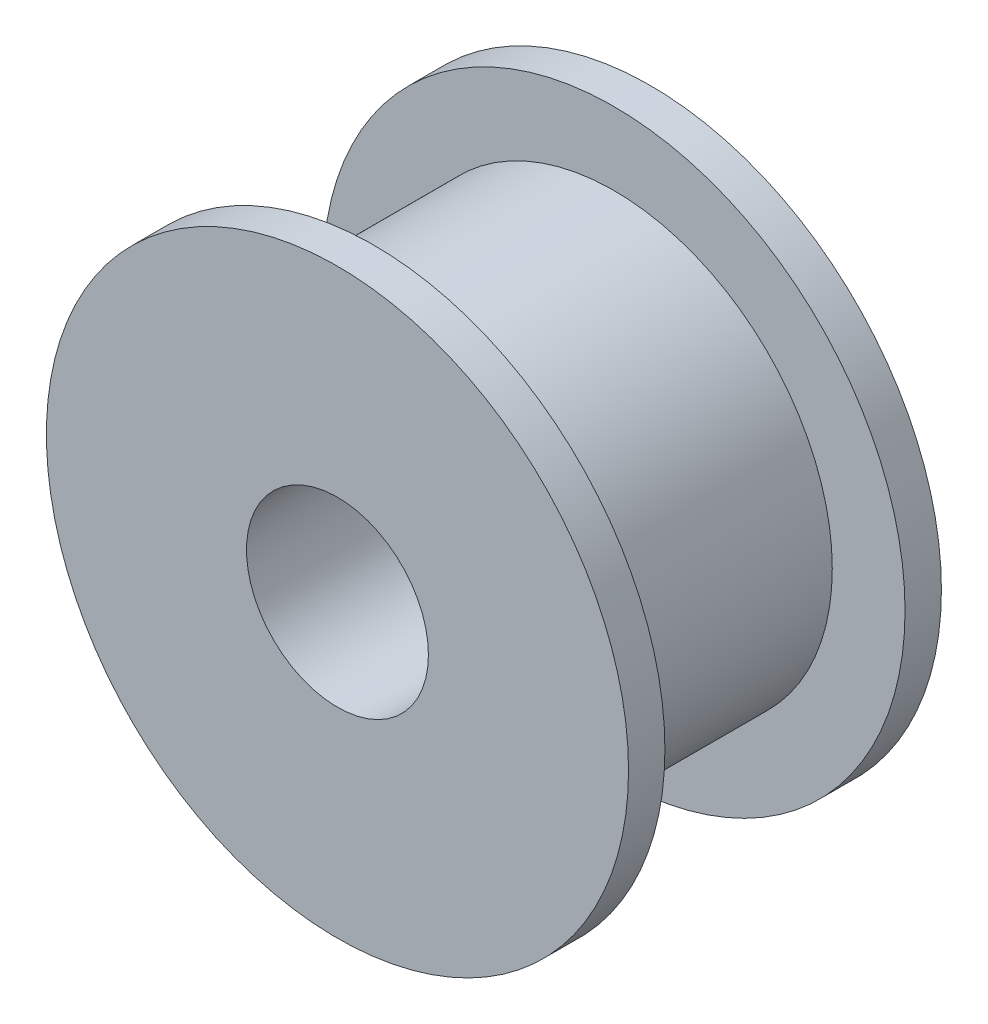
ISO-10303-21;
HEADER;
FILE_DESCRIPTION(('STEP AP214'),'2;1');
FILE_NAME('part.step','',(''),(''),'','','');
FILE_SCHEMA(('AUTOMOTIVE_DESIGN { 1 0 10303 214 1 1 1 1 }'));
ENDSEC;
DATA;
#1=APPLICATION_CONTEXT('core data for automotive mechanical design processes');
#2=APPLICATION_PROTOCOL_DEFINITION('international standard','automotive_design',2000,#1);
#3=PRODUCT_CONTEXT('',#1,'mechanical');
#4=PRODUCT('Part','Part','',(#3));
#5=PRODUCT_RELATED_PRODUCT_CATEGORY('part','',(#4));
#6=PRODUCT_DEFINITION_FORMATION('','',#4);
#7=PRODUCT_DEFINITION_CONTEXT('part definition',#1,'design');
#8=PRODUCT_DEFINITION('design','',#6,#7);
#9=PRODUCT_DEFINITION_SHAPE('','',#8);
#10=(LENGTH_UNIT() NAMED_UNIT(*) SI_UNIT(.MILLI.,.METRE.));
#11=(NAMED_UNIT(*) PLANE_ANGLE_UNIT() SI_UNIT($,.RADIAN.));
#12=(NAMED_UNIT(*) SI_UNIT($,.STERADIAN.) SOLID_ANGLE_UNIT());
#13=UNCERTAINTY_MEASURE_WITH_UNIT(LENGTH_MEASURE(1.E-05),#10,'distance_accuracy_value','');
#14=(GEOMETRIC_REPRESENTATION_CONTEXT(3) GLOBAL_UNCERTAINTY_ASSIGNED_CONTEXT((#13)) GLOBAL_UNIT_ASSIGNED_CONTEXT((#10,
#11,#12)) REPRESENTATION_CONTEXT('',''));
#15=CARTESIAN_POINT('',(0.,0.,0.));
#16=DIRECTION('',(0.,0.,1.));
#17=DIRECTION('',(1.,0.,0.));
#18=AXIS2_PLACEMENT_3D('',#15,#16,#17);
#19=CARTESIAN_POINT('',(0.,0.,1.));
#20=DIRECTION('',(0.,0.,1.));
#21=DIRECTION('',(1.,0.,0.));
#22=AXIS2_PLACEMENT_3D('',#19,#20,#21);
#23=PLANE('',#22);
#24=CARTESIAN_POINT('',(0.,0.,1.));
#25=DIRECTION('',(0.,0.,1.));
#26=DIRECTION('',(1.,0.,0.));
#27=AXIS2_PLACEMENT_3D('',#24,#25,#26);
#28=CIRCLE('',#27,8.);
#29=CARTESIAN_POINT('',(8.,0.,1.));
#30=VERTEX_POINT('',#29);
#31=EDGE_CURVE('E10',#30,#30,#28,.T.);
#32=ORIENTED_EDGE('',*,*,#31,.T.);
#33=EDGE_LOOP('',(#32));
#34=FACE_BOUND('',#33,.T.);
#35=CARTESIAN_POINT('',(0.,0.,1.));
#36=DIRECTION('',(0.,0.,1.));
#37=DIRECTION('',(1.,0.,0.));
#38=AXIS2_PLACEMENT_3D('',#35,#36,#37);
#39=CIRCLE('',#38,6.);
#40=CARTESIAN_POINT('',(6.,0.,1.));
#41=VERTEX_POINT('',#40);
#42=EDGE_CURVE('E48',#41,#41,#39,.T.);
#43=ORIENTED_EDGE('',*,*,#42,.F.);
#44=EDGE_LOOP('',(#43));
#45=FACE_BOUND('',#44,.T.);
#46=ADVANCED_FACE('F32',(#34,#45),#23,.T.);
#47=CARTESIAN_POINT('',(0.,0.,0.));
#48=DIRECTION('',(0.,0.,1.));
#49=DIRECTION('',(1.,0.,0.));
#50=AXIS2_PLACEMENT_3D('',#47,#48,#49);
#51=PLANE('',#50);
#52=CARTESIAN_POINT('',(0.,0.,0.));
#53=DIRECTION('',(0.,0.,1.));
#54=DIRECTION('',(1.,0.,0.));
#55=AXIS2_PLACEMENT_3D('',#52,#53,#54);
#56=CIRCLE('',#55,8.);
#57=CARTESIAN_POINT('',(8.,0.,0.));
#58=VERTEX_POINT('',#57);
#59=EDGE_CURVE('E36',#58,#58,#56,.T.);
#60=ORIENTED_EDGE('',*,*,#59,.F.);
#61=EDGE_LOOP('',(#60));
#62=FACE_BOUND('',#61,.T.);
#63=CARTESIAN_POINT('',(0.,0.,0.));
#64=DIRECTION('',(0.,0.,1.));
#65=DIRECTION('',(1.,0.,0.));
#66=AXIS2_PLACEMENT_3D('',#63,#64,#65);
#67=CIRCLE('',#66,2.5);
#68=CARTESIAN_POINT('',(2.5,0.,0.));
#69=VERTEX_POINT('',#68);
#70=EDGE_CURVE('E43',#69,#69,#67,.T.);
#71=ORIENTED_EDGE('',*,*,#70,.T.);
#72=EDGE_LOOP('',(#71));
#73=FACE_BOUND('',#72,.T.);
#74=ADVANCED_FACE('F81',(#62,#73),#51,.F.);
#75=CARTESIAN_POINT('',(0.,0.,1.));
#76=DIRECTION('',(0.,0.,-1.));
#77=DIRECTION('',(-1.,0.,0.));
#78=AXIS2_PLACEMENT_3D('',#75,#76,#77);
#79=CYLINDRICAL_SURFACE('',#78,8.);
#80=ORIENTED_EDGE('',*,*,#31,.F.);
#81=EDGE_LOOP('',(#80));
#82=FACE_BOUND('',#81,.T.);
#83=ORIENTED_EDGE('',*,*,#59,.T.);
#84=EDGE_LOOP('',(#83));
#85=FACE_BOUND('',#84,.T.);
#86=ADVANCED_FACE('F34',(#82,#85),#79,.T.);
#87=CARTESIAN_POINT('',(0.,0.,1.));
#88=DIRECTION('',(0.,0.,-1.));
#89=DIRECTION('',(-1.,0.,0.));
#90=AXIS2_PLACEMENT_3D('',#87,#88,#89);
#91=CYLINDRICAL_SURFACE('',#90,2.5);
#92=ORIENTED_EDGE('',*,*,#70,.F.);
#93=EDGE_LOOP('',(#92));
#94=FACE_BOUND('',#93,.T.);
#95=CARTESIAN_POINT('',(0.,0.,8.6));
#96=DIRECTION('',(0.,0.,1.));
#97=DIRECTION('',(1.,0.,0.));
#98=AXIS2_PLACEMENT_3D('',#95,#96,#97);
#99=CIRCLE('',#98,2.5);
#100=CARTESIAN_POINT('',(2.5,0.,8.6));
#101=VERTEX_POINT('',#100);
#102=EDGE_CURVE('E57',#101,#101,#99,.T.);
#103=ORIENTED_EDGE('',*,*,#102,.T.);
#104=EDGE_LOOP('',(#103));
#105=FACE_BOUND('',#104,.T.);
#106=ADVANCED_FACE('F63',(#94,#105),#91,.F.);
#107=CARTESIAN_POINT('',(0.,0.,7.6));
#108=DIRECTION('',(0.,0.,-1.));
#109=DIRECTION('',(-1.,0.,0.));
#110=AXIS2_PLACEMENT_3D('',#107,#108,#109);
#111=CYLINDRICAL_SURFACE('',#110,6.);
#112=CARTESIAN_POINT('',(0.,0.,7.6));
#113=DIRECTION('',(0.,0.,1.));
#114=DIRECTION('',(1.,0.,0.));
#115=AXIS2_PLACEMENT_3D('',#112,#113,#114);
#116=CIRCLE('',#115,6.);
#117=CARTESIAN_POINT('',(6.,0.,7.6));
#118=VERTEX_POINT('',#117);
#119=EDGE_CURVE('E47',#118,#118,#116,.T.);
#120=ORIENTED_EDGE('',*,*,#119,.F.);
#121=EDGE_LOOP('',(#120));
#122=FACE_BOUND('',#121,.T.);
#123=ORIENTED_EDGE('',*,*,#42,.T.);
#124=EDGE_LOOP('',(#123));
#125=FACE_BOUND('',#124,.T.);
#126=ADVANCED_FACE('F68',(#122,#125),#111,.T.);
#127=CARTESIAN_POINT('',(0.,0.,8.6));
#128=DIRECTION('',(0.,0.,1.));
#129=DIRECTION('',(1.,0.,0.));
#130=AXIS2_PLACEMENT_3D('',#127,#128,#129);
#131=PLANE('',#130);
#132=CARTESIAN_POINT('',(0.,0.,8.6));
#133=DIRECTION('',(0.,0.,1.));
#134=DIRECTION('',(1.,0.,0.));
#135=AXIS2_PLACEMENT_3D('',#132,#133,#134);
#136=CIRCLE('',#135,8.);
#137=CARTESIAN_POINT('',(8.,0.,8.6));
#138=VERTEX_POINT('',#137);
#139=EDGE_CURVE('E51',#138,#138,#136,.T.);
#140=ORIENTED_EDGE('',*,*,#139,.T.);
#141=EDGE_LOOP('',(#140));
#142=FACE_BOUND('',#141,.T.);
#143=ORIENTED_EDGE('',*,*,#102,.F.);
#144=EDGE_LOOP('',(#143));
#145=FACE_BOUND('',#144,.T.);
#146=ADVANCED_FACE('F65',(#142,#145),#131,.T.);
#147=CARTESIAN_POINT('',(0.,0.,7.6));
#148=DIRECTION('',(0.,0.,1.));
#149=DIRECTION('',(1.,0.,0.));
#150=AXIS2_PLACEMENT_3D('',#147,#148,#149);
#151=PLANE('',#150);
#152=ORIENTED_EDGE('',*,*,#119,.T.);
#153=EDGE_LOOP('',(#152));
#154=FACE_BOUND('',#153,.T.);
#155=CARTESIAN_POINT('',(0.,0.,7.6));
#156=DIRECTION('',(0.,0.,1.));
#157=DIRECTION('',(1.,0.,0.));
#158=AXIS2_PLACEMENT_3D('',#155,#156,#157);
#159=CIRCLE('',#158,8.);
#160=CARTESIAN_POINT('',(8.,0.,7.6));
#161=VERTEX_POINT('',#160);
#162=EDGE_CURVE('E54',#161,#161,#159,.T.);
#163=ORIENTED_EDGE('',*,*,#162,.F.);
#164=EDGE_LOOP('',(#163));
#165=FACE_BOUND('',#164,.T.);
#166=ADVANCED_FACE('F67',(#154,#165),#151,.F.);
#167=CARTESIAN_POINT('',(0.,0.,8.6));
#168=DIRECTION('',(0.,0.,-1.));
#169=DIRECTION('',(-1.,0.,0.));
#170=AXIS2_PLACEMENT_3D('',#167,#168,#169);
#171=CYLINDRICAL_SURFACE('',#170,8.);
#172=ORIENTED_EDGE('',*,*,#139,.F.);
#173=EDGE_LOOP('',(#172));
#174=FACE_BOUND('',#173,.T.);
#175=ORIENTED_EDGE('',*,*,#162,.T.);
#176=EDGE_LOOP('',(#175));
#177=FACE_BOUND('',#176,.T.);
#178=ADVANCED_FACE('F75',(#174,#177),#171,.T.);
#179=CLOSED_SHELL('',(#46,#74,#86,#106,#126,#146,#166,#178));
#180=MANIFOLD_SOLID_BREP('B2',#179);
#181=ADVANCED_BREP_SHAPE_REPRESENTATION('',(#18,#180),#14);
#182=SHAPE_DEFINITION_REPRESENTATION(#9,#181);
ENDSEC;
END-ISO-10303-21;
